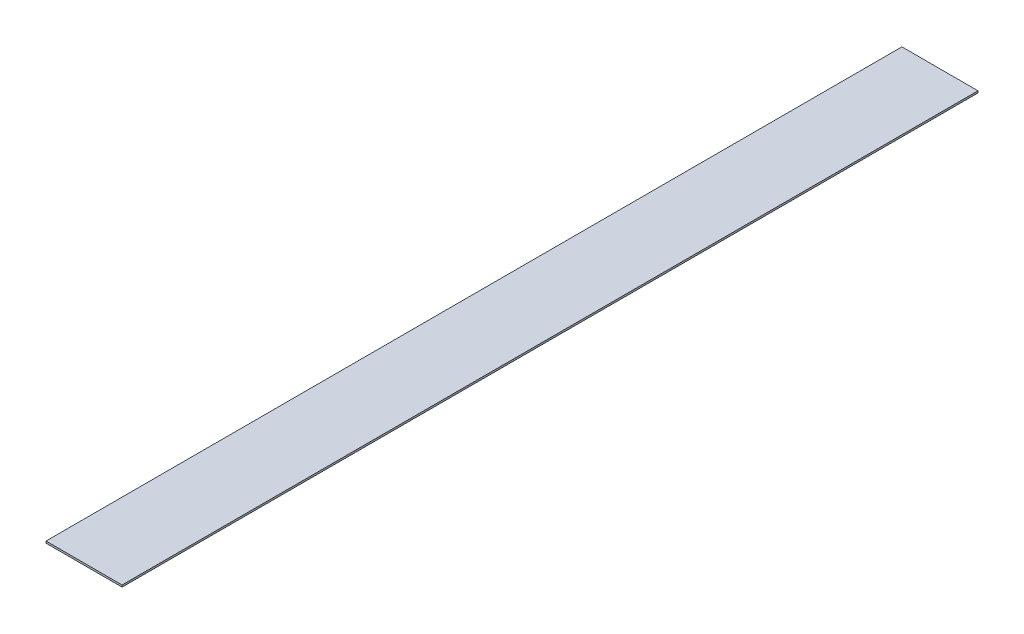
ISO-10303-21;
HEADER;
FILE_DESCRIPTION(('STEP AP214'),'2;1');
FILE_NAME('part.step','',(''),(''),'','','');
FILE_SCHEMA(('AUTOMOTIVE_DESIGN { 1 0 10303 214 1 1 1 1 }'));
ENDSEC;
DATA;
#1=APPLICATION_CONTEXT('core data for automotive mechanical design processes');
#2=APPLICATION_PROTOCOL_DEFINITION('international standard','automotive_design',2000,#1);
#3=PRODUCT_CONTEXT('',#1,'mechanical');
#4=PRODUCT('Part','Part','',(#3));
#5=PRODUCT_RELATED_PRODUCT_CATEGORY('part','',(#4));
#6=PRODUCT_DEFINITION_FORMATION('','',#4);
#7=PRODUCT_DEFINITION_CONTEXT('part definition',#1,'design');
#8=PRODUCT_DEFINITION('design','',#6,#7);
#9=PRODUCT_DEFINITION_SHAPE('','',#8);
#10=(LENGTH_UNIT() NAMED_UNIT(*) SI_UNIT(.MILLI.,.METRE.));
#11=(NAMED_UNIT(*) PLANE_ANGLE_UNIT() SI_UNIT($,.RADIAN.));
#12=(NAMED_UNIT(*) SI_UNIT($,.STERADIAN.) SOLID_ANGLE_UNIT());
#13=UNCERTAINTY_MEASURE_WITH_UNIT(LENGTH_MEASURE(1.E-05),#10,'distance_accuracy_value','');
#14=(GEOMETRIC_REPRESENTATION_CONTEXT(3) GLOBAL_UNCERTAINTY_ASSIGNED_CONTEXT((#13)) GLOBAL_UNIT_ASSIGNED_CONTEXT((#10,
#11,#12)) REPRESENTATION_CONTEXT('',''));
#15=CARTESIAN_POINT('',(0.,0.,0.));
#16=DIRECTION('',(0.,0.,1.));
#17=DIRECTION('',(1.,0.,0.));
#18=AXIS2_PLACEMENT_3D('',#15,#16,#17);
#19=CARTESIAN_POINT('',(-4.00000000000001,0.0999999999999998,90.));
#20=DIRECTION('',(1.,0.,0.));
#21=DIRECTION('',(0.,0.,-1.));
#22=AXIS2_PLACEMENT_3D('',#19,#20,#21);
#23=PLANE('',#22);
#24=DIRECTION('',(0.,-1.,0.));
#25=VECTOR('',#24,1.);
#26=CARTESIAN_POINT('',(-4.00000000000001,0.0999999999999998,0.));
#27=LINE('',#26,#25);
#28=CARTESIAN_POINT('',(-4.00000000000001,0.0999999999999998,0.));
#29=VERTEX_POINT('',#28);
#30=CARTESIAN_POINT('',(-4.00000000000001,-0.0999999999999998,0.));
#31=VERTEX_POINT('',#30);
#32=EDGE_CURVE('E107',#29,#31,#27,.T.);
#33=ORIENTED_EDGE('',*,*,#32,.T.);
#34=DIRECTION('',(0.,0.,-1.));
#35=VECTOR('',#34,1.);
#36=CARTESIAN_POINT('',(-4.00000000000001,-0.0999999999999998,90.));
#37=LINE('',#36,#35);
#38=CARTESIAN_POINT('',(-4.00000000000001,-0.0999999999999998,90.));
#39=VERTEX_POINT('',#38);
#40=EDGE_CURVE('E11',#39,#31,#37,.T.);
#41=ORIENTED_EDGE('',*,*,#40,.F.);
#42=DIRECTION('',(0.,-1.,0.));
#43=VECTOR('',#42,1.);
#44=CARTESIAN_POINT('',(-4.00000000000001,0.0999999999999998,90.));
#45=LINE('',#44,#43);
#46=CARTESIAN_POINT('',(-4.00000000000001,0.0999999999999998,90.));
#47=VERTEX_POINT('',#46);
#48=EDGE_CURVE('E91',#47,#39,#45,.T.);
#49=ORIENTED_EDGE('',*,*,#48,.F.);
#50=DIRECTION('',(0.,0.,-1.));
#51=VECTOR('',#50,1.);
#52=CARTESIAN_POINT('',(-4.00000000000001,0.0999999999999998,90.));
#53=LINE('',#52,#51);
#54=EDGE_CURVE('E103',#47,#29,#53,.T.);
#55=ORIENTED_EDGE('',*,*,#54,.T.);
#56=EDGE_LOOP('',(#33,#41,#49,#55));
#57=FACE_BOUND('',#56,.T.);
#58=ADVANCED_FACE('F39',(#57),#23,.F.);
#59=CARTESIAN_POINT('',(-4.00000000000001,-0.0999999999999998,90.));
#60=DIRECTION('',(0.,1.,0.));
#61=DIRECTION('',(0.,0.,1.));
#62=AXIS2_PLACEMENT_3D('',#59,#60,#61);
#63=PLANE('',#62);
#64=DIRECTION('',(1.,0.,0.));
#65=VECTOR('',#64,1.);
#66=CARTESIAN_POINT('',(-4.00000000000001,-0.0999999999999998,0.));
#67=LINE('',#66,#65);
#68=CARTESIAN_POINT('',(3.99999999999999,-0.0999999999999998,0.));
#69=VERTEX_POINT('',#68);
#70=EDGE_CURVE('E96',#31,#69,#67,.T.);
#71=ORIENTED_EDGE('',*,*,#70,.T.);
#72=DIRECTION('',(0.,0.,-1.));
#73=VECTOR('',#72,1.);
#74=CARTESIAN_POINT('',(3.99999999999999,-0.0999999999999998,90.));
#75=LINE('',#74,#73);
#76=CARTESIAN_POINT('',(3.99999999999999,-0.0999999999999998,90.));
#77=VERTEX_POINT('',#76);
#78=EDGE_CURVE('E48',#77,#69,#75,.T.);
#79=ORIENTED_EDGE('',*,*,#78,.F.);
#80=DIRECTION('',(1.,0.,0.));
#81=VECTOR('',#80,1.);
#82=CARTESIAN_POINT('',(-4.00000000000001,-0.0999999999999998,90.));
#83=LINE('',#82,#81);
#84=EDGE_CURVE('E86',#39,#77,#83,.T.);
#85=ORIENTED_EDGE('',*,*,#84,.F.);
#86=ORIENTED_EDGE('',*,*,#40,.T.);
#87=EDGE_LOOP('',(#71,#79,#85,#86));
#88=FACE_BOUND('',#87,.T.);
#89=ADVANCED_FACE('F95',(#88),#63,.F.);
#90=CARTESIAN_POINT('',(3.99999999999999,0.0999999999999998,90.));
#91=DIRECTION('',(-1.,0.,0.));
#92=DIRECTION('',(0.,-1.,0.));
#93=AXIS2_PLACEMENT_3D('',#90,#91,#92);
#94=PLANE('',#93);
#95=DIRECTION('',(0.,1.,0.));
#96=VECTOR('',#95,1.);
#97=CARTESIAN_POINT('',(3.99999999999999,0.0999999999999998,0.));
#98=LINE('',#97,#96);
#99=CARTESIAN_POINT('',(3.99999999999999,0.0999999999999998,0.));
#100=VERTEX_POINT('',#99);
#101=EDGE_CURVE('E73',#69,#100,#98,.T.);
#102=ORIENTED_EDGE('',*,*,#101,.T.);
#103=DIRECTION('',(0.,0.,-1.));
#104=VECTOR('',#103,1.);
#105=CARTESIAN_POINT('',(3.99999999999999,0.0999999999999998,90.));
#106=LINE('',#105,#104);
#107=CARTESIAN_POINT('',(3.99999999999999,0.0999999999999998,90.));
#108=VERTEX_POINT('',#107);
#109=EDGE_CURVE('E98',#108,#100,#106,.T.);
#110=ORIENTED_EDGE('',*,*,#109,.F.);
#111=DIRECTION('',(0.,1.,0.));
#112=VECTOR('',#111,1.);
#113=CARTESIAN_POINT('',(3.99999999999999,0.0999999999999998,90.));
#114=LINE('',#113,#112);
#115=EDGE_CURVE('E89',#77,#108,#114,.T.);
#116=ORIENTED_EDGE('',*,*,#115,.F.);
#117=ORIENTED_EDGE('',*,*,#78,.T.);
#118=EDGE_LOOP('',(#102,#110,#116,#117));
#119=FACE_BOUND('',#118,.T.);
#120=ADVANCED_FACE('F99',(#119),#94,.F.);
#121=CARTESIAN_POINT('',(-4.00000000000001,0.0999999999999998,90.));
#122=DIRECTION('',(0.,-1.,0.));
#123=DIRECTION('',(0.,0.,-1.));
#124=AXIS2_PLACEMENT_3D('',#121,#122,#123);
#125=PLANE('',#124);
#126=DIRECTION('',(-1.,0.,0.));
#127=VECTOR('',#126,1.);
#128=CARTESIAN_POINT('',(-4.00000000000001,0.0999999999999998,0.));
#129=LINE('',#128,#127);
#130=EDGE_CURVE('E79',#100,#29,#129,.T.);
#131=ORIENTED_EDGE('',*,*,#130,.T.);
#132=ORIENTED_EDGE('',*,*,#54,.F.);
#133=DIRECTION('',(-1.,0.,0.));
#134=VECTOR('',#133,1.);
#135=CARTESIAN_POINT('',(-4.00000000000001,0.0999999999999998,90.));
#136=LINE('',#135,#134);
#137=EDGE_CURVE('E56',#108,#47,#136,.T.);
#138=ORIENTED_EDGE('',*,*,#137,.F.);
#139=ORIENTED_EDGE('',*,*,#109,.T.);
#140=EDGE_LOOP('',(#131,#132,#138,#139));
#141=FACE_BOUND('',#140,.T.);
#142=ADVANCED_FACE('F120',(#141),#125,.F.);
#143=CARTESIAN_POINT('',(0.,0.,90.));
#144=DIRECTION('',(0.,0.,1.));
#145=DIRECTION('',(1.,0.,0.));
#146=AXIS2_PLACEMENT_3D('',#143,#144,#145);
#147=PLANE('',#146);
#148=ORIENTED_EDGE('',*,*,#48,.T.);
#149=ORIENTED_EDGE('',*,*,#84,.T.);
#150=ORIENTED_EDGE('',*,*,#115,.T.);
#151=ORIENTED_EDGE('',*,*,#137,.T.);
#152=EDGE_LOOP('',(#148,#149,#150,#151));
#153=FACE_BOUND('',#152,.T.);
#154=ADVANCED_FACE('F87',(#153),#147,.T.);
#155=CARTESIAN_POINT('',(0.,0.,0.));
#156=DIRECTION('',(0.,0.,1.));
#157=DIRECTION('',(1.,0.,0.));
#158=AXIS2_PLACEMENT_3D('',#155,#156,#157);
#159=PLANE('',#158);
#160=ORIENTED_EDGE('',*,*,#32,.F.);
#161=ORIENTED_EDGE('',*,*,#130,.F.);
#162=ORIENTED_EDGE('',*,*,#101,.F.);
#163=ORIENTED_EDGE('',*,*,#70,.F.);
#164=EDGE_LOOP('',(#160,#161,#162,#163));
#165=FACE_BOUND('',#164,.T.);
#166=ADVANCED_FACE('F123',(#165),#159,.F.);
#167=CLOSED_SHELL('',(#58,#89,#120,#142,#154,#166));
#168=MANIFOLD_SOLID_BREP('B2',#167);
#169=ADVANCED_BREP_SHAPE_REPRESENTATION('',(#18,#168),#14);
#170=SHAPE_DEFINITION_REPRESENTATION(#9,#169);
ENDSEC;
END-ISO-10303-21;
